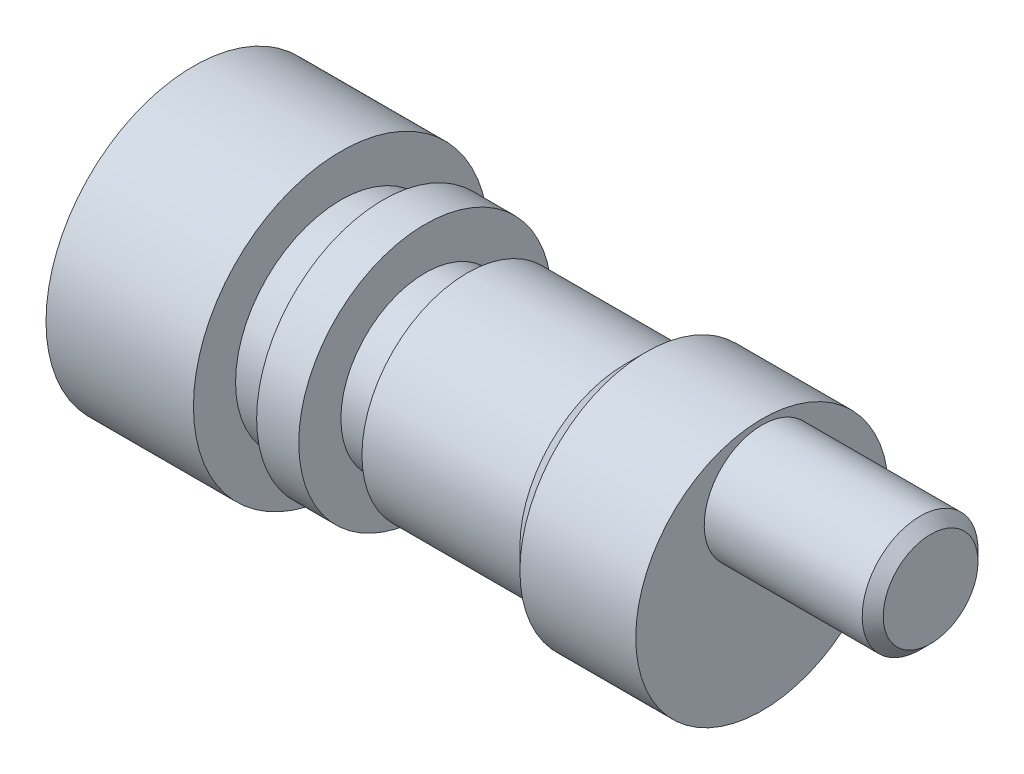
ISO-10303-21;
HEADER;
FILE_DESCRIPTION(('STEP AP214'),'2;1');
FILE_NAME('part.step','',(''),(''),'','','');
FILE_SCHEMA(('AUTOMOTIVE_DESIGN { 1 0 10303 214 1 1 1 1 }'));
ENDSEC;
DATA;
#1=APPLICATION_CONTEXT('core data for automotive mechanical design processes');
#2=APPLICATION_PROTOCOL_DEFINITION('international standard','automotive_design',2000,#1);
#3=PRODUCT_CONTEXT('',#1,'mechanical');
#4=PRODUCT('Part','Part','',(#3));
#5=PRODUCT_RELATED_PRODUCT_CATEGORY('part','',(#4));
#6=PRODUCT_DEFINITION_FORMATION('','',#4);
#7=PRODUCT_DEFINITION_CONTEXT('part definition',#1,'design');
#8=PRODUCT_DEFINITION('design','',#6,#7);
#9=PRODUCT_DEFINITION_SHAPE('','',#8);
#10=(LENGTH_UNIT() NAMED_UNIT(*) SI_UNIT(.MILLI.,.METRE.));
#11=(NAMED_UNIT(*) PLANE_ANGLE_UNIT() SI_UNIT($,.RADIAN.));
#12=(NAMED_UNIT(*) SI_UNIT($,.STERADIAN.) SOLID_ANGLE_UNIT());
#13=UNCERTAINTY_MEASURE_WITH_UNIT(LENGTH_MEASURE(1.E-05),#10,'distance_accuracy_value','');
#14=(GEOMETRIC_REPRESENTATION_CONTEXT(3) GLOBAL_UNCERTAINTY_ASSIGNED_CONTEXT((#13)) GLOBAL_UNIT_ASSIGNED_CONTEXT((#10,
#11,#12)) REPRESENTATION_CONTEXT('',''));
#15=CARTESIAN_POINT('',(0.,0.,0.));
#16=DIRECTION('',(0.,0.,1.));
#17=DIRECTION('',(1.,0.,0.));
#18=AXIS2_PLACEMENT_3D('',#15,#16,#17);
#19=CARTESIAN_POINT('',(20.,6.,0.));
#20=DIRECTION('',(-1.,0.,0.));
#21=DIRECTION('',(0.,0.,1.));
#22=AXIS2_PLACEMENT_3D('',#19,#20,#21);
#23=PLANE('',#22);
#24=CARTESIAN_POINT('',(20.,3.,0.));
#25=DIRECTION('',(1.,0.,0.));
#26=DIRECTION('',(0.,1.,0.));
#27=AXIS2_PLACEMENT_3D('',#24,#25,#26);
#28=CIRCLE('',#27,2.75);
#29=CARTESIAN_POINT('',(20.,5.75,0.));
#30=VERTEX_POINT('',#29);
#31=EDGE_CURVE('E391',#30,#30,#28,.T.);
#32=ORIENTED_EDGE('',*,*,#31,.F.);
#33=EDGE_LOOP('',(#32));
#34=FACE_BOUND('',#33,.T.);
#35=CARTESIAN_POINT('',(20.,0.,0.));
#36=DIRECTION('',(-1.,0.,0.));
#37=DIRECTION('',(0.,0.,1.));
#38=AXIS2_PLACEMENT_3D('',#35,#36,#37);
#39=CIRCLE('',#38,6.);
#40=CARTESIAN_POINT('',(20.,0.,6.));
#41=VERTEX_POINT('',#40);
#42=EDGE_CURVE('E10',#41,#41,#39,.T.);
#43=ORIENTED_EDGE('',*,*,#42,.F.);
#44=EDGE_LOOP('',(#43));
#45=FACE_BOUND('',#44,.T.);
#46=ADVANCED_FACE('F348',(#34,#45),#23,.F.);
#47=CARTESIAN_POINT('',(-22.1901098901099,0.,0.));
#48=DIRECTION('',(-1.,0.,0.));
#49=DIRECTION('',(0.,0.,1.));
#50=AXIS2_PLACEMENT_3D('',#47,#48,#49);
#51=CYLINDRICAL_SURFACE('',#50,6.);
#52=CARTESIAN_POINT('',(14.5,0.,0.));
#53=DIRECTION('',(-1.,0.,0.));
#54=DIRECTION('',(0.,0.,1.));
#55=AXIS2_PLACEMENT_3D('',#52,#53,#54);
#56=CIRCLE('',#55,6.);
#57=CARTESIAN_POINT('',(14.5,0.,6.));
#58=VERTEX_POINT('',#57);
#59=EDGE_CURVE('E354',#58,#58,#56,.T.);
#60=ORIENTED_EDGE('',*,*,#59,.F.);
#61=EDGE_LOOP('',(#60));
#62=FACE_BOUND('',#61,.T.);
#63=ORIENTED_EDGE('',*,*,#42,.T.);
#64=EDGE_LOOP('',(#63));
#65=FACE_BOUND('',#64,.T.);
#66=ADVANCED_FACE('F417',(#62,#65),#51,.T.);
#67=CARTESIAN_POINT('',(14.5,0.,0.));
#68=DIRECTION('',(1.,0.,0.));
#69=DIRECTION('',(0.,0.,-1.));
#70=AXIS2_PLACEMENT_3D('',#67,#68,#69);
#71=CONICAL_SURFACE('',#70,6.,0.785398163397448);
#72=CARTESIAN_POINT('',(13.5,0.,0.));
#73=DIRECTION('',(-1.,0.,0.));
#74=DIRECTION('',(0.,0.,1.));
#75=AXIS2_PLACEMENT_3D('',#72,#73,#74);
#76=CIRCLE('',#75,5.);
#77=CARTESIAN_POINT('',(13.5,0.,5.));
#78=VERTEX_POINT('',#77);
#79=EDGE_CURVE('E358',#78,#78,#76,.T.);
#80=ORIENTED_EDGE('',*,*,#79,.F.);
#81=EDGE_LOOP('',(#80));
#82=FACE_BOUND('',#81,.T.);
#83=ORIENTED_EDGE('',*,*,#59,.T.);
#84=EDGE_LOOP('',(#83));
#85=FACE_BOUND('',#84,.T.);
#86=ADVANCED_FACE('F423',(#82,#85),#71,.T.);
#87=CARTESIAN_POINT('',(-22.1901098901099,0.,0.));
#88=DIRECTION('',(-1.,0.,0.));
#89=DIRECTION('',(0.,0.,1.));
#90=AXIS2_PLACEMENT_3D('',#87,#88,#89);
#91=CYLINDRICAL_SURFACE('',#90,5.);
#92=CARTESIAN_POINT('',(6.,0.,0.));
#93=DIRECTION('',(-1.,0.,0.));
#94=DIRECTION('',(0.,0.,1.));
#95=AXIS2_PLACEMENT_3D('',#92,#93,#94);
#96=CIRCLE('',#95,5.);
#97=CARTESIAN_POINT('',(6.,0.,5.));
#98=VERTEX_POINT('',#97);
#99=EDGE_CURVE('E362',#98,#98,#96,.T.);
#100=ORIENTED_EDGE('',*,*,#99,.F.);
#101=EDGE_LOOP('',(#100));
#102=FACE_BOUND('',#101,.T.);
#103=ORIENTED_EDGE('',*,*,#79,.T.);
#104=EDGE_LOOP('',(#103));
#105=FACE_BOUND('',#104,.T.);
#106=ADVANCED_FACE('F432',(#102,#105),#91,.T.);
#107=CARTESIAN_POINT('',(6.,4.,0.));
#108=DIRECTION('',(1.,0.,0.));
#109=DIRECTION('',(0.,0.,-1.));
#110=AXIS2_PLACEMENT_3D('',#107,#108,#109);
#111=PLANE('',#110);
#112=CARTESIAN_POINT('',(6.,0.,0.));
#113=DIRECTION('',(-1.,0.,0.));
#114=DIRECTION('',(0.,0.,1.));
#115=AXIS2_PLACEMENT_3D('',#112,#113,#114);
#116=CIRCLE('',#115,4.);
#117=CARTESIAN_POINT('',(6.,0.,4.));
#118=VERTEX_POINT('',#117);
#119=EDGE_CURVE('E367',#118,#118,#116,.T.);
#120=ORIENTED_EDGE('',*,*,#119,.F.);
#121=EDGE_LOOP('',(#120));
#122=FACE_BOUND('',#121,.T.);
#123=ORIENTED_EDGE('',*,*,#99,.T.);
#124=EDGE_LOOP('',(#123));
#125=FACE_BOUND('',#124,.T.);
#126=ADVANCED_FACE('F438',(#122,#125),#111,.F.);
#127=CARTESIAN_POINT('',(-22.1901098901099,0.,0.));
#128=DIRECTION('',(-1.,0.,0.));
#129=DIRECTION('',(0.,0.,1.));
#130=AXIS2_PLACEMENT_3D('',#127,#128,#129);
#131=CYLINDRICAL_SURFACE('',#130,4.);
#132=CARTESIAN_POINT('',(4.,0.,0.));
#133=DIRECTION('',(-1.,0.,0.));
#134=DIRECTION('',(0.,0.,1.));
#135=AXIS2_PLACEMENT_3D('',#132,#133,#134);
#136=CIRCLE('',#135,4.);
#137=CARTESIAN_POINT('',(4.,0.,4.));
#138=VERTEX_POINT('',#137);
#139=EDGE_CURVE('E370',#138,#138,#136,.T.);
#140=ORIENTED_EDGE('',*,*,#139,.F.);
#141=EDGE_LOOP('',(#140));
#142=FACE_BOUND('',#141,.T.);
#143=ORIENTED_EDGE('',*,*,#119,.T.);
#144=EDGE_LOOP('',(#143));
#145=FACE_BOUND('',#144,.T.);
#146=ADVANCED_FACE('F442',(#142,#145),#131,.T.);
#147=CARTESIAN_POINT('',(4.,6.,0.));
#148=DIRECTION('',(-1.,0.,0.));
#149=DIRECTION('',(0.,0.,1.));
#150=AXIS2_PLACEMENT_3D('',#147,#148,#149);
#151=PLANE('',#150);
#152=CARTESIAN_POINT('',(4.,0.,0.));
#153=DIRECTION('',(-1.,0.,0.));
#154=DIRECTION('',(0.,0.,1.));
#155=AXIS2_PLACEMENT_3D('',#152,#153,#154);
#156=CIRCLE('',#155,6.);
#157=CARTESIAN_POINT('',(4.,0.,6.));
#158=VERTEX_POINT('',#157);
#159=EDGE_CURVE('E373',#158,#158,#156,.T.);
#160=ORIENTED_EDGE('',*,*,#159,.F.);
#161=EDGE_LOOP('',(#160));
#162=FACE_BOUND('',#161,.T.);
#163=ORIENTED_EDGE('',*,*,#139,.T.);
#164=EDGE_LOOP('',(#163));
#165=FACE_BOUND('',#164,.T.);
#166=ADVANCED_FACE('F446',(#162,#165),#151,.F.);
#167=CARTESIAN_POINT('',(-22.1901098901099,0.,0.));
#168=DIRECTION('',(-1.,0.,0.));
#169=DIRECTION('',(0.,0.,1.));
#170=AXIS2_PLACEMENT_3D('',#167,#168,#169);
#171=CYLINDRICAL_SURFACE('',#170,6.);
#172=CARTESIAN_POINT('',(2.,0.,0.));
#173=DIRECTION('',(-1.,0.,0.));
#174=DIRECTION('',(0.,0.,1.));
#175=AXIS2_PLACEMENT_3D('',#172,#173,#174);
#176=CIRCLE('',#175,6.);
#177=CARTESIAN_POINT('',(2.,0.,6.));
#178=VERTEX_POINT('',#177);
#179=EDGE_CURVE('E376',#178,#178,#176,.T.);
#180=ORIENTED_EDGE('',*,*,#179,.F.);
#181=EDGE_LOOP('',(#180));
#182=FACE_BOUND('',#181,.T.);
#183=ORIENTED_EDGE('',*,*,#159,.T.);
#184=EDGE_LOOP('',(#183));
#185=FACE_BOUND('',#184,.T.);
#186=ADVANCED_FACE('F450',(#182,#185),#171,.T.);
#187=CARTESIAN_POINT('',(2.,5.,0.));
#188=DIRECTION('',(1.,0.,0.));
#189=DIRECTION('',(0.,0.,-1.));
#190=AXIS2_PLACEMENT_3D('',#187,#188,#189);
#191=PLANE('',#190);
#192=CARTESIAN_POINT('',(2.,0.,0.));
#193=DIRECTION('',(-1.,0.,0.));
#194=DIRECTION('',(0.,0.,1.));
#195=AXIS2_PLACEMENT_3D('',#192,#193,#194);
#196=CIRCLE('',#195,5.);
#197=CARTESIAN_POINT('',(2.,0.,5.));
#198=VERTEX_POINT('',#197);
#199=EDGE_CURVE('E379',#198,#198,#196,.T.);
#200=ORIENTED_EDGE('',*,*,#199,.F.);
#201=EDGE_LOOP('',(#200));
#202=FACE_BOUND('',#201,.T.);
#203=ORIENTED_EDGE('',*,*,#179,.T.);
#204=EDGE_LOOP('',(#203));
#205=FACE_BOUND('',#204,.T.);
#206=ADVANCED_FACE('F454',(#202,#205),#191,.F.);
#207=CARTESIAN_POINT('',(-22.1901098901099,0.,0.));
#208=DIRECTION('',(-1.,0.,0.));
#209=DIRECTION('',(0.,0.,1.));
#210=AXIS2_PLACEMENT_3D('',#207,#208,#209);
#211=CYLINDRICAL_SURFACE('',#210,5.);
#212=CARTESIAN_POINT('',(0.,0.,0.));
#213=DIRECTION('',(-1.,0.,0.));
#214=DIRECTION('',(0.,0.,1.));
#215=AXIS2_PLACEMENT_3D('',#212,#213,#214);
#216=CIRCLE('',#215,5.);
#217=CARTESIAN_POINT('',(0.,0.,5.));
#218=VERTEX_POINT('',#217);
#219=EDGE_CURVE('E382',#218,#218,#216,.T.);
#220=ORIENTED_EDGE('',*,*,#219,.F.);
#221=EDGE_LOOP('',(#220));
#222=FACE_BOUND('',#221,.T.);
#223=ORIENTED_EDGE('',*,*,#199,.T.);
#224=EDGE_LOOP('',(#223));
#225=FACE_BOUND('',#224,.T.);
#226=ADVANCED_FACE('F458',(#222,#225),#211,.T.);
#227=CARTESIAN_POINT('',(0.,7.,0.));
#228=DIRECTION('',(-1.,0.,0.));
#229=DIRECTION('',(0.,0.,1.));
#230=AXIS2_PLACEMENT_3D('',#227,#228,#229);
#231=PLANE('',#230);
#232=CARTESIAN_POINT('',(0.,0.,0.));
#233=DIRECTION('',(-1.,0.,0.));
#234=DIRECTION('',(0.,0.,1.));
#235=AXIS2_PLACEMENT_3D('',#232,#233,#234);
#236=CIRCLE('',#235,7.);
#237=CARTESIAN_POINT('',(0.,0.,7.));
#238=VERTEX_POINT('',#237);
#239=EDGE_CURVE('E385',#238,#238,#236,.T.);
#240=ORIENTED_EDGE('',*,*,#239,.F.);
#241=EDGE_LOOP('',(#240));
#242=FACE_BOUND('',#241,.T.);
#243=ORIENTED_EDGE('',*,*,#219,.T.);
#244=EDGE_LOOP('',(#243));
#245=FACE_BOUND('',#244,.T.);
#246=ADVANCED_FACE('F462',(#242,#245),#231,.F.);
#247=CARTESIAN_POINT('',(-22.1901098901099,0.,0.));
#248=DIRECTION('',(-1.,0.,0.));
#249=DIRECTION('',(0.,0.,1.));
#250=AXIS2_PLACEMENT_3D('',#247,#248,#249);
#251=CYLINDRICAL_SURFACE('',#250,7.);
#252=CARTESIAN_POINT('',(-7.,0.,0.));
#253=DIRECTION('',(-1.,0.,0.));
#254=DIRECTION('',(0.,0.,1.));
#255=AXIS2_PLACEMENT_3D('',#252,#253,#254);
#256=CIRCLE('',#255,7.);
#257=CARTESIAN_POINT('',(-7.,0.,7.));
#258=VERTEX_POINT('',#257);
#259=EDGE_CURVE('E388',#258,#258,#256,.T.);
#260=ORIENTED_EDGE('',*,*,#259,.F.);
#261=EDGE_LOOP('',(#260));
#262=FACE_BOUND('',#261,.T.);
#263=ORIENTED_EDGE('',*,*,#239,.T.);
#264=EDGE_LOOP('',(#263));
#265=FACE_BOUND('',#264,.T.);
#266=ADVANCED_FACE('F466',(#262,#265),#251,.T.);
#267=CARTESIAN_POINT('',(-7.,0.,0.));
#268=DIRECTION('',(1.,0.,0.));
#269=DIRECTION('',(0.,0.,-1.));
#270=AXIS2_PLACEMENT_3D('',#267,#268,#269);
#271=PLANE('',#270);
#272=ORIENTED_EDGE('',*,*,#259,.T.);
#273=EDGE_LOOP('',(#272));
#274=FACE_BOUND('',#273,.T.);
#275=ADVANCED_FACE('F413',(#274),#271,.F.);
#276=CARTESIAN_POINT('',(32.8532066333063,3.,0.));
#277=DIRECTION('',(1.,0.,0.));
#278=DIRECTION('',(0.,1.,0.));
#279=AXIS2_PLACEMENT_3D('',#276,#277,#278);
#280=CYLINDRICAL_SURFACE('',#279,2.75);
#281=ORIENTED_EDGE('',*,*,#31,.T.);
#282=EDGE_LOOP('',(#281));
#283=FACE_BOUND('',#282,.T.);
#284=CARTESIAN_POINT('',(27.5,3.,0.));
#285=DIRECTION('',(1.,0.,0.));
#286=DIRECTION('',(0.,1.,0.));
#287=AXIS2_PLACEMENT_3D('',#284,#285,#286);
#288=CIRCLE('',#287,2.75);
#289=CARTESIAN_POINT('',(27.5,5.75,0.));
#290=VERTEX_POINT('',#289);
#291=EDGE_CURVE('E394',#290,#290,#288,.T.);
#292=ORIENTED_EDGE('',*,*,#291,.F.);
#293=EDGE_LOOP('',(#292));
#294=FACE_BOUND('',#293,.T.);
#295=ADVANCED_FACE('F405',(#283,#294),#280,.T.);
#296=CARTESIAN_POINT('',(28.,3.,0.));
#297=DIRECTION('',(-1.,0.,0.));
#298=DIRECTION('',(0.,-1.,0.));
#299=AXIS2_PLACEMENT_3D('',#296,#297,#298);
#300=CONICAL_SURFACE('',#299,2.25,0.785398163397448);
#301=ORIENTED_EDGE('',*,*,#291,.T.);
#302=EDGE_LOOP('',(#301));
#303=FACE_BOUND('',#302,.T.);
#304=CARTESIAN_POINT('',(28.,3.,0.));
#305=DIRECTION('',(1.,0.,0.));
#306=DIRECTION('',(0.,1.,0.));
#307=AXIS2_PLACEMENT_3D('',#304,#305,#306);
#308=CIRCLE('',#307,2.25);
#309=CARTESIAN_POINT('',(28.,5.25,0.));
#310=VERTEX_POINT('',#309);
#311=EDGE_CURVE('E397',#310,#310,#308,.T.);
#312=ORIENTED_EDGE('',*,*,#311,.F.);
#313=EDGE_LOOP('',(#312));
#314=FACE_BOUND('',#313,.T.);
#315=ADVANCED_FACE('F403',(#303,#314),#300,.T.);
#316=CARTESIAN_POINT('',(28.,5.25,0.));
#317=DIRECTION('',(1.,0.,0.));
#318=DIRECTION('',(0.,1.,0.));
#319=AXIS2_PLACEMENT_3D('',#316,#317,#318);
#320=PLANE('',#319);
#321=ORIENTED_EDGE('',*,*,#311,.T.);
#322=EDGE_LOOP('',(#321));
#323=FACE_BOUND('',#322,.T.);
#324=ADVANCED_FACE('F401',(#323),#320,.T.);
#325=CLOSED_SHELL('',(#46,#66,#86,#106,#126,#146,#166,#186,#206,#226,#246,#266,#275,#295,#315,#324));
#326=MANIFOLD_SOLID_BREP('B2',#325);
#327=ADVANCED_BREP_SHAPE_REPRESENTATION('',(#18,#326),#14);
#328=SHAPE_DEFINITION_REPRESENTATION(#9,#327);
ENDSEC;
END-ISO-10303-21;
